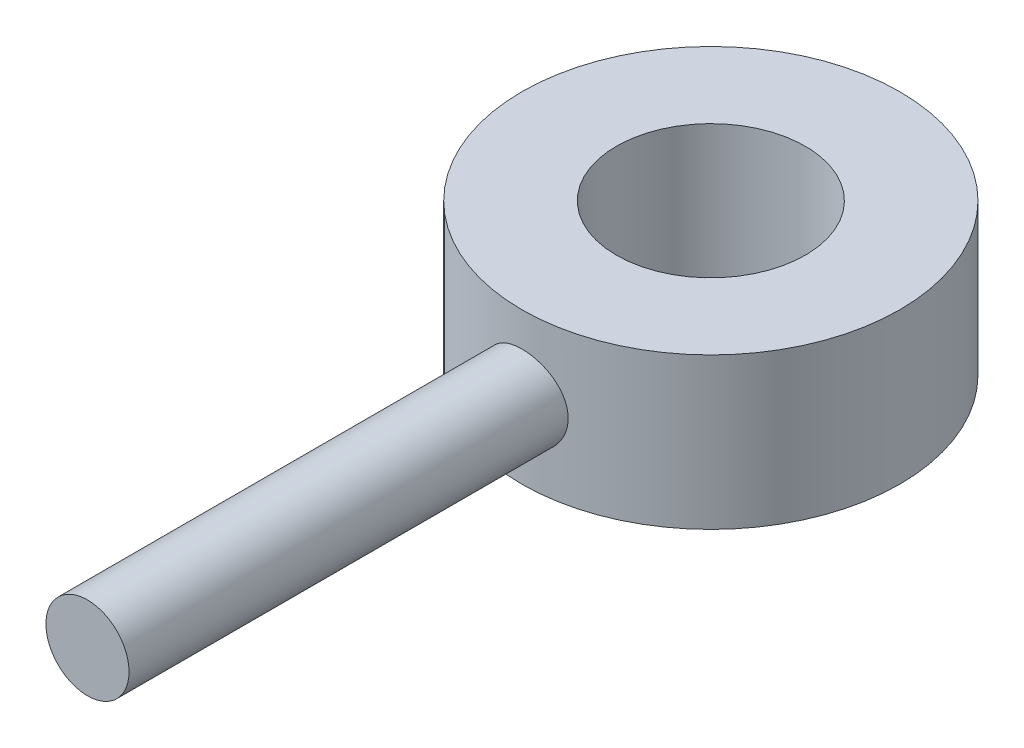
ISO-10303-21;
HEADER;
FILE_DESCRIPTION(('STEP AP214'),'2;1');
FILE_NAME('part.step','',(''),(''),'','','');
FILE_SCHEMA(('AUTOMOTIVE_DESIGN { 1 0 10303 214 1 1 1 1 }'));
ENDSEC;
DATA;
#1=APPLICATION_CONTEXT('core data for automotive mechanical design processes');
#2=APPLICATION_PROTOCOL_DEFINITION('international standard','automotive_design',2000,#1);
#3=PRODUCT_CONTEXT('',#1,'mechanical');
#4=PRODUCT('Part','Part','',(#3));
#5=PRODUCT_RELATED_PRODUCT_CATEGORY('part','',(#4));
#6=PRODUCT_DEFINITION_FORMATION('','',#4);
#7=PRODUCT_DEFINITION_CONTEXT('part definition',#1,'design');
#8=PRODUCT_DEFINITION('design','',#6,#7);
#9=PRODUCT_DEFINITION_SHAPE('','',#8);
#10=(LENGTH_UNIT() NAMED_UNIT(*) SI_UNIT(.MILLI.,.METRE.));
#11=(NAMED_UNIT(*) PLANE_ANGLE_UNIT() SI_UNIT($,.RADIAN.));
#12=(NAMED_UNIT(*) SI_UNIT($,.STERADIAN.) SOLID_ANGLE_UNIT());
#13=UNCERTAINTY_MEASURE_WITH_UNIT(LENGTH_MEASURE(1.E-05),#10,'distance_accuracy_value','');
#14=(GEOMETRIC_REPRESENTATION_CONTEXT(3) GLOBAL_UNCERTAINTY_ASSIGNED_CONTEXT((#13)) GLOBAL_UNIT_ASSIGNED_CONTEXT((#10,
#11,#12)) REPRESENTATION_CONTEXT('',''));
#15=CARTESIAN_POINT('',(0.,0.,0.));
#16=DIRECTION('',(0.,0.,1.));
#17=DIRECTION('',(1.,0.,0.));
#18=AXIS2_PLACEMENT_3D('',#15,#16,#17);
#19=CARTESIAN_POINT('',(0.,4.,0.));
#20=DIRECTION('',(0.,1.,0.));
#21=DIRECTION('',(0.,0.,1.));
#22=AXIS2_PLACEMENT_3D('',#19,#20,#21);
#23=PLANE('',#22);
#24=CARTESIAN_POINT('',(0.,4.,0.));
#25=DIRECTION('',(0.,1.,0.));
#26=DIRECTION('',(0.,0.,1.));
#27=AXIS2_PLACEMENT_3D('',#24,#25,#26);
#28=CIRCLE('',#27,5.);
#29=CARTESIAN_POINT('',(0.,4.,5.));
#30=VERTEX_POINT('',#29);
#31=EDGE_CURVE('E10',#30,#30,#28,.T.);
#32=ORIENTED_EDGE('',*,*,#31,.T.);
#33=EDGE_LOOP('',(#32));
#34=FACE_BOUND('',#33,.T.);
#35=CARTESIAN_POINT('',(0.,4.,0.));
#36=DIRECTION('',(0.,1.,0.));
#37=DIRECTION('',(0.,0.,1.));
#38=AXIS2_PLACEMENT_3D('',#35,#36,#37);
#39=CIRCLE('',#38,2.5);
#40=CARTESIAN_POINT('',(0.,4.,2.5));
#41=VERTEX_POINT('',#40);
#42=EDGE_CURVE('E55',#41,#41,#39,.T.);
#43=ORIENTED_EDGE('',*,*,#42,.F.);
#44=EDGE_LOOP('',(#43));
#45=FACE_BOUND('',#44,.T.);
#46=ADVANCED_FACE('F41',(#34,#45),#23,.T.);
#47=CARTESIAN_POINT('',(0.,0.,0.));
#48=DIRECTION('',(0.,1.,0.));
#49=DIRECTION('',(0.,0.,1.));
#50=AXIS2_PLACEMENT_3D('',#47,#48,#49);
#51=PLANE('',#50);
#52=CARTESIAN_POINT('',(0.,0.,0.));
#53=DIRECTION('',(0.,1.,0.));
#54=DIRECTION('',(0.,0.,1.));
#55=AXIS2_PLACEMENT_3D('',#52,#53,#54);
#56=CIRCLE('',#55,5.);
#57=CARTESIAN_POINT('',(0.,0.,5.));
#58=VERTEX_POINT('',#57);
#59=EDGE_CURVE('E46',#58,#58,#56,.T.);
#60=ORIENTED_EDGE('',*,*,#59,.F.);
#61=EDGE_LOOP('',(#60));
#62=FACE_BOUND('',#61,.T.);
#63=CARTESIAN_POINT('',(0.,0.,0.));
#64=DIRECTION('',(0.,1.,0.));
#65=DIRECTION('',(0.,0.,1.));
#66=AXIS2_PLACEMENT_3D('',#63,#64,#65);
#67=CIRCLE('',#66,2.5);
#68=CARTESIAN_POINT('',(0.,0.,2.5));
#69=VERTEX_POINT('',#68);
#70=EDGE_CURVE('E57',#69,#69,#67,.T.);
#71=ORIENTED_EDGE('',*,*,#70,.T.);
#72=EDGE_LOOP('',(#71));
#73=FACE_BOUND('',#72,.T.);
#74=ADVANCED_FACE('F85',(#62,#73),#51,.F.);
#75=CARTESIAN_POINT('',(0.,4.,0.));
#76=DIRECTION('',(0.,-1.,0.));
#77=DIRECTION('',(0.,0.,-1.));
#78=AXIS2_PLACEMENT_3D('',#75,#76,#77);
#79=CYLINDRICAL_SURFACE('',#78,5.);
#80=CARTESIAN_POINT('',(1.1,2.,4.87749935930288));
#81=CARTESIAN_POINT('',(1.09999791492612,1.9390201794353,4.87750059192786));
#82=CARTESIAN_POINT('',(1.09491201866376,1.87801537811326,4.87865539644142));
#83=CARTESIAN_POINT('',(1.07472546298642,1.75774129032022,4.88314122250592));
#84=CARTESIAN_POINT('',(1.05961761771207,1.69847328101234,4.88647380552498));
#85=CARTESIAN_POINT('',(1.0198864288525,1.58342998059707,4.89491990534441));
#86=CARTESIAN_POINT('',(0.995273595944624,1.52765091028854,4.90003145433793));
#87=CARTESIAN_POINT('',(0.937261257278608,1.42101230207449,4.91145717082736));
#88=CARTESIAN_POINT('',(0.903861910884835,1.37015267496603,4.91777131651074));
#89=CARTESIAN_POINT('',(0.828616225712395,1.27392683949134,4.93101133539934));
#90=CARTESIAN_POINT('',(0.786648093254168,1.22865694066119,4.93794511097895));
#91=CARTESIAN_POINT('',(0.695719054453303,1.1457392824436,4.95157396934833));
#92=CARTESIAN_POINT('',(0.646757601115515,1.10809211983954,4.95826903341563));
#93=CARTESIAN_POINT('',(0.542585501574226,1.04110713566132,4.97075222751559));
#94=CARTESIAN_POINT('',(0.487313887417924,1.0118620215218,4.97652994590525));
#95=CARTESIAN_POINT('',(0.372492215823986,0.963111197150299,4.98643815937044));
#96=CARTESIAN_POINT('',(0.312942645065846,0.943604381046737,4.99056884147107));
#97=CARTESIAN_POINT('',(0.19225695217033,0.915187000374263,4.99666172270461));
#98=CARTESIAN_POINT('',(0.131160926699203,0.906113415539374,4.99865724849314));
#99=CARTESIAN_POINT('',(0.00828344107533811,0.898310289156249,5.00037046767797));
#100=CARTESIAN_POINT('',(-0.0534979389590024,0.899579550986584,5.00008842457891));
#101=CARTESIAN_POINT('',(-0.174868311810049,0.91230483353016,4.99730372921666));
#102=CARTESIAN_POINT('',(-0.234476737170561,0.92358512956355,4.99483938472223));
#103=CARTESIAN_POINT('',(-0.350933235851258,0.955732158774795,4.98801066744812));
#104=CARTESIAN_POINT('',(-0.40778118327906,0.976599328711623,4.98364620810345));
#105=CARTESIAN_POINT('',(-0.517589876653114,1.02748268543179,4.9734461693194));
#106=CARTESIAN_POINT('',(-0.570518802020045,1.05756532435277,4.96759995975693));
#107=CARTESIAN_POINT('',(-0.670641236268086,1.12597609928104,4.95507718712354));
#108=CARTESIAN_POINT('',(-0.717833953910853,1.16430537079315,4.94840050975635));
#109=CARTESIAN_POINT('',(-0.806189587464993,1.24907752031974,4.9347848703112));
#110=CARTESIAN_POINT('',(-0.847204687115553,1.29567418789222,4.92784334554032));
#111=CARTESIAN_POINT('',(-0.920866253616029,1.39515617125098,4.91461189441242));
#112=CARTESIAN_POINT('',(-0.953512488233042,1.44804166149014,4.90832198614041));
#113=CARTESIAN_POINT('',(-1.00957639469399,1.55884098990999,4.89709906904939));
#114=CARTESIAN_POINT('',(-1.03296584029736,1.61676956045469,4.89217022405119));
#115=CARTESIAN_POINT('',(-1.06963334728129,1.73586913636489,4.88428499577542));
#116=CARTESIAN_POINT('',(-1.08291303337616,1.79703961903993,4.88132829556883));
#117=CARTESIAN_POINT('',(-1.09875417213259,1.91953517814268,4.87778683874614));
#118=CARTESIAN_POINT('',(-1.10153098432832,1.98083105919776,4.87715443070833));
#119=CARTESIAN_POINT('',(-1.09687086480016,2.10300992013702,4.87820457466623));
#120=CARTESIAN_POINT('',(-1.08943464358614,2.16389292844821,4.87988696562385));
#121=CARTESIAN_POINT('',(-1.0647464744292,2.2827660294168,4.88533212070861));
#122=CARTESIAN_POINT('',(-1.04761340088457,2.34078207203772,4.88906967493981));
#123=CARTESIAN_POINT('',(-1.00414670243287,2.45311998653837,4.89818124053484));
#124=CARTESIAN_POINT('',(-0.977812188429666,2.50744150082533,4.90355541003142));
#125=CARTESIAN_POINT('',(-0.91621659031443,2.61177959607808,4.91543919766926));
#126=CARTESIAN_POINT('',(-0.880822990698791,2.66171604472883,4.92196518151733));
#127=CARTESIAN_POINT('',(-0.802287084126657,2.75501980794127,4.9353742402688));
#128=CARTESIAN_POINT('',(-0.75914380310317,2.79838629545192,4.94225735998362));
#129=CARTESIAN_POINT('',(-0.665358139823839,2.87815643013216,4.95576238310321));
#130=CARTESIAN_POINT('',(-0.614589557453773,2.91441316700773,4.96237690160789));
#131=CARTESIAN_POINT('',(-0.507557357883074,2.9778834007809,4.97446295328537));
#132=CARTESIAN_POINT('',(-0.451293999053488,3.00509732261797,4.97993454016225));
#133=CARTESIAN_POINT('',(-0.335221928140962,3.04950552627181,4.98908712095463));
#134=CARTESIAN_POINT('',(-0.275438598062818,3.0667636957286,4.99277950649837));
#135=CARTESIAN_POINT('',(-0.153730744771621,3.09096976221849,4.99800693284399));
#136=CARTESIAN_POINT('',(-0.0918065380326897,3.09791917652643,4.99954229112212));
#137=CARTESIAN_POINT('',(0.0310311984112525,3.10124157983504,5.0002731072272));
#138=CARTESIAN_POINT('',(0.0919386128262424,3.0978338089841,4.99951707009963));
#139=CARTESIAN_POINT('',(0.212289959032807,3.08102942125089,4.99585410740956));
#140=CARTESIAN_POINT('',(0.271733917710235,3.06763298801683,4.99294722139187));
#141=CARTESIAN_POINT('',(0.387299068879444,3.03133713027188,4.9853129244489));
#142=CARTESIAN_POINT('',(0.443430555354196,3.00846913363254,4.98059153797251));
#143=CARTESIAN_POINT('',(0.551088880418725,2.95390980328589,4.96983212605049));
#144=CARTESIAN_POINT('',(0.602615265777603,2.92221760236689,4.96379397121017));
#145=CARTESIAN_POINT('',(0.700669047552351,2.85019638228957,4.95091484957698));
#146=CARTESIAN_POINT('',(0.747081628642719,2.80971338936581,4.94406070779334));
#147=CARTESIAN_POINT('',(0.832529567035146,2.72156988642554,4.93039261746621));
#148=CARTESIAN_POINT('',(0.871563140639815,2.67390764598885,4.92357867902557));
#149=CARTESIAN_POINT('',(0.941655472561291,2.5719811785591,4.91065939968106));
#150=CARTESIAN_POINT('',(0.972598894559436,2.51763618036073,4.90456492229851));
#151=CARTESIAN_POINT('',(1.02486431597407,2.40439458465942,4.89391152757273));
#152=CARTESIAN_POINT('',(1.04619441572814,2.34550186833968,4.88935131825545));
#153=CARTESIAN_POINT('',(1.07484341292603,2.23879573237756,4.88312099991116));
#154=CARTESIAN_POINT('',(1.08425895070442,2.19155879645607,4.88102694527707));
#155=CARTESIAN_POINT('',(1.0968379109729,2.09621972950757,4.87821567299023));
#156=CARTESIAN_POINT('',(1.10000164527932,2.04811764175183,4.87749838666953));
#157=CARTESIAN_POINT('',(1.1,2.,4.87749935930288));
#158=B_SPLINE_CURVE_WITH_KNOTS('',3,(#80,#81,#82,#83,#84,#85,#86,#87,#88,#89,#90,#91,#92,#93,
#94,#95,#96,#97,#98,#99,#100,#101,#102,#103,#104,#105,#106,#107,#108,#109,#110,#111,#112,#113,
#114,#115,#116,#117,#118,#119,#120,#121,#122,#123,#124,#125,#126,#127,#128,#129,#130,#131,#132,
#133,#134,#135,#136,#137,#138,#139,#140,#141,#142,#143,#144,#145,#146,#147,#148,#149,#150,#151,
#152,#153,#154,#155,#156,#157),.UNSPECIFIED.,.T.,.F.,(4,2,2,2,2,2,2,2,2,2,2,2,2,2,2,2,2,2,2,2,2,
2,2,2,2,2,2,2,2,2,2,2,2,2,2,2,2,2,4),(0.,0.182763101090787,0.365657387395347,0.548350004463604,
0.731039308194149,0.91653294157345,1.10204109162356,1.28952374121687,1.47698509561857,
1.66147574685417,1.84594505364379,2.02723901933906,2.20854124524725,2.39118289476655,
2.573849708903,2.76036115186886,2.946877769898,3.13395882042845,3.32100979927812,
3.50420386278735,3.68738518232592,3.86836805363358,4.04936841738637,4.23318501321453,
4.4170247293642,4.60433520453909,4.79163687638516,4.97772283580126,5.16378140378501,
5.34592912523117,5.5280734978526,5.70961827316065,5.89118089635048,6.07622535920624,
6.26131449506935,6.44891386127562,6.6363548563871,6.780575813307,6.92478957684879),.UNSPECIFIED.);
#159=CARTESIAN_POINT('',(1.1,2.,4.87749935930288));
#160=VERTEX_POINT('',#159);
#161=EDGE_CURVE('E61',#160,#160,#158,.T.);
#162=ORIENTED_EDGE('',*,*,#161,.T.);
#163=EDGE_LOOP('',(#162));
#164=FACE_BOUND('',#163,.T.);
#165=ORIENTED_EDGE('',*,*,#31,.F.);
#166=EDGE_LOOP('',(#165));
#167=FACE_BOUND('',#166,.T.);
#168=ORIENTED_EDGE('',*,*,#59,.T.);
#169=EDGE_LOOP('',(#168));
#170=FACE_BOUND('',#169,.T.);
#171=ADVANCED_FACE('F43',(#164,#167,#170),#79,.T.);
#172=CARTESIAN_POINT('',(0.,4.,0.));
#173=DIRECTION('',(0.,-1.,0.));
#174=DIRECTION('',(0.,0.,-1.));
#175=AXIS2_PLACEMENT_3D('',#172,#173,#174);
#176=CYLINDRICAL_SURFACE('',#175,2.5);
#177=ORIENTED_EDGE('',*,*,#42,.T.);
#178=EDGE_LOOP('',(#177));
#179=FACE_BOUND('',#178,.T.);
#180=ORIENTED_EDGE('',*,*,#70,.F.);
#181=EDGE_LOOP('',(#180));
#182=FACE_BOUND('',#181,.T.);
#183=ADVANCED_FACE('F79',(#179,#182),#176,.F.);
#184=CARTESIAN_POINT('',(0.,2.,2.5));
#185=DIRECTION('',(0.,0.,1.));
#186=DIRECTION('',(1.,0.,0.));
#187=AXIS2_PLACEMENT_3D('',#184,#185,#186);
#188=CYLINDRICAL_SURFACE('',#187,1.1);
#189=CARTESIAN_POINT('',(0.,2.,16.5));
#190=DIRECTION('',(0.,0.,1.));
#191=DIRECTION('',(1.,0.,0.));
#192=AXIS2_PLACEMENT_3D('',#189,#190,#191);
#193=CIRCLE('',#192,1.1);
#194=CARTESIAN_POINT('',(1.1,2.,16.5));
#195=VERTEX_POINT('',#194);
#196=EDGE_CURVE('E72',#195,#195,#193,.T.);
#197=ORIENTED_EDGE('',*,*,#196,.F.);
#198=EDGE_LOOP('',(#197));
#199=FACE_BOUND('',#198,.T.);
#200=ORIENTED_EDGE('',*,*,#161,.F.);
#201=EDGE_LOOP('',(#200));
#202=FACE_BOUND('',#201,.T.);
#203=ADVANCED_FACE('F73',(#199,#202),#188,.T.);
#204=CARTESIAN_POINT('',(0.,2.,16.5));
#205=DIRECTION('',(0.,0.,1.));
#206=DIRECTION('',(1.,0.,0.));
#207=AXIS2_PLACEMENT_3D('',#204,#205,#206);
#208=PLANE('',#207);
#209=ORIENTED_EDGE('',*,*,#196,.T.);
#210=EDGE_LOOP('',(#209));
#211=FACE_BOUND('',#210,.T.);
#212=ADVANCED_FACE('F78',(#211),#208,.T.);
#213=CLOSED_SHELL('',(#46,#74,#171,#183,#203,#212));
#214=MANIFOLD_SOLID_BREP('B2',#213);
#215=ADVANCED_BREP_SHAPE_REPRESENTATION('',(#18,#214),#14);
#216=SHAPE_DEFINITION_REPRESENTATION(#9,#215);
ENDSEC;
END-ISO-10303-21;
